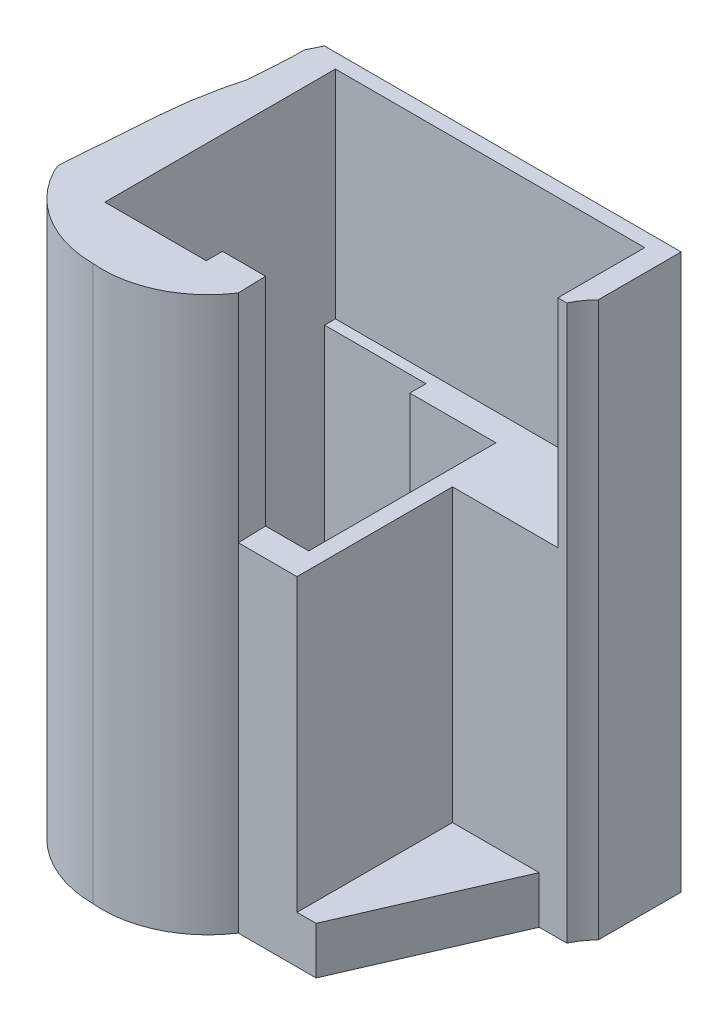
ISO-10303-21;
HEADER;
FILE_DESCRIPTION(('STEP AP214'),'2;1');
FILE_NAME('part.step','',(''),(''),'','','');
FILE_SCHEMA(('AUTOMOTIVE_DESIGN { 1 0 10303 214 1 1 1 1 }'));
ENDSEC;
DATA;
#1=APPLICATION_CONTEXT('core data for automotive mechanical design processes');
#2=APPLICATION_PROTOCOL_DEFINITION('international standard','automotive_design',2000,#1);
#3=PRODUCT_CONTEXT('',#1,'mechanical');
#4=PRODUCT('Part','Part','',(#3));
#5=PRODUCT_RELATED_PRODUCT_CATEGORY('part','',(#4));
#6=PRODUCT_DEFINITION_FORMATION('','',#4);
#7=PRODUCT_DEFINITION_CONTEXT('part definition',#1,'design');
#8=PRODUCT_DEFINITION('design','',#6,#7);
#9=PRODUCT_DEFINITION_SHAPE('','',#8);
#10=(LENGTH_UNIT() NAMED_UNIT(*) SI_UNIT(.MILLI.,.METRE.));
#11=(NAMED_UNIT(*) PLANE_ANGLE_UNIT() SI_UNIT($,.RADIAN.));
#12=(NAMED_UNIT(*) SI_UNIT($,.STERADIAN.) SOLID_ANGLE_UNIT());
#13=UNCERTAINTY_MEASURE_WITH_UNIT(LENGTH_MEASURE(1.E-05),#10,'distance_accuracy_value','');
#14=(GEOMETRIC_REPRESENTATION_CONTEXT(3) GLOBAL_UNCERTAINTY_ASSIGNED_CONTEXT((#13)) GLOBAL_UNIT_ASSIGNED_CONTEXT((#10,
#11,#12)) REPRESENTATION_CONTEXT('',''));
#15=CARTESIAN_POINT('',(0.,0.,0.));
#16=DIRECTION('',(0.,0.,1.));
#17=DIRECTION('',(1.,0.,0.));
#18=AXIS2_PLACEMENT_3D('',#15,#16,#17);
#19=CARTESIAN_POINT('',(-3.17398927918233,105.,-16.7844868257719));
#20=DIRECTION('',(0.,0.,-1.));
#21=DIRECTION('',(-1.,0.,0.));
#22=AXIS2_PLACEMENT_3D('',#19,#20,#21);
#23=PLANE('',#22);
#24=DIRECTION('',(1.,0.,0.));
#25=VECTOR('',#24,1.);
#26=CARTESIAN_POINT('',(-3.17398927918233,50.,-16.7844868257719));
#27=LINE('',#26,#25);
#28=CARTESIAN_POINT('',(-18.1734399627761,50.,-16.7844868257719));
#29=VERTEX_POINT('',#28);
#30=CARTESIAN_POINT('',(-3.17398927918233,50.,-16.7844868257719));
#31=VERTEX_POINT('',#30);
#32=EDGE_CURVE('E268',#29,#31,#27,.T.);
#33=ORIENTED_EDGE('',*,*,#32,.F.);
#34=DIRECTION('',(0.,-1.,0.));
#35=VECTOR('',#34,1.);
#36=CARTESIAN_POINT('',(-18.1734399627761,105.,-16.7844868257719));
#37=LINE('',#36,#35);
#38=CARTESIAN_POINT('',(-18.1734399627761,0.,-16.7844868257719));
#39=VERTEX_POINT('',#38);
#40=EDGE_CURVE('E267',#29,#39,#37,.T.);
#41=ORIENTED_EDGE('',*,*,#40,.T.);
#42=DIRECTION('',(1.,0.,0.));
#43=VECTOR('',#42,1.);
#44=CARTESIAN_POINT('',(-3.17398927918233,0.,-16.7844868257719));
#45=LINE('',#44,#43);
#46=CARTESIAN_POINT('',(-3.17398927918233,0.,-16.7844868257719));
#47=VERTEX_POINT('',#46);
#48=EDGE_CURVE('E315',#39,#47,#45,.T.);
#49=ORIENTED_EDGE('',*,*,#48,.T.);
#50=DIRECTION('',(0.,-1.,0.));
#51=VECTOR('',#50,1.);
#52=CARTESIAN_POINT('',(-3.17398927918233,105.,-16.7844868257719));
#53=LINE('',#52,#51);
#54=EDGE_CURVE('E64',#31,#47,#53,.T.);
#55=ORIENTED_EDGE('',*,*,#54,.F.);
#56=EDGE_LOOP('',(#33,#41,#49,#55));
#57=FACE_BOUND('',#56,.T.);
#58=ADVANCED_FACE('F41',(#57),#23,.F.);
#59=CARTESIAN_POINT('',(9.57552243956772,105.,-14.384485299893));
#60=DIRECTION('',(0.,0.,-1.));
#61=DIRECTION('',(-1.,0.,0.));
#62=AXIS2_PLACEMENT_3D('',#59,#60,#61);
#63=PLANE('',#62);
#64=DIRECTION('',(1.,0.,0.));
#65=VECTOR('',#64,1.);
#66=CARTESIAN_POINT('',(9.57552243956772,50.,-14.384485299893));
#67=LINE('',#66,#65);
#68=CARTESIAN_POINT('',(-3.17398927918233,50.,-14.384485299893));
#69=VERTEX_POINT('',#68);
#70=CARTESIAN_POINT('',(9.57552243956772,50.,-14.384485299893));
#71=VERTEX_POINT('',#70);
#72=EDGE_CURVE('E262',#69,#71,#67,.T.);
#73=ORIENTED_EDGE('',*,*,#72,.F.);
#74=DIRECTION('',(0.,-1.,0.));
#75=VECTOR('',#74,1.);
#76=CARTESIAN_POINT('',(-3.17398927918233,105.,-14.384485299893));
#77=LINE('',#76,#75);
#78=CARTESIAN_POINT('',(-3.17398927918233,0.,-14.384485299893));
#79=VERTEX_POINT('',#78);
#80=EDGE_CURVE('E348',#69,#79,#77,.T.);
#81=ORIENTED_EDGE('',*,*,#80,.T.);
#82=DIRECTION('',(1.,0.,0.));
#83=VECTOR('',#82,1.);
#84=CARTESIAN_POINT('',(9.57552243956772,0.,-14.384485299893));
#85=LINE('',#84,#83);
#86=CARTESIAN_POINT('',(9.57552243956772,0.,-14.384485299893));
#87=VERTEX_POINT('',#86);
#88=EDGE_CURVE('E319',#79,#87,#85,.T.);
#89=ORIENTED_EDGE('',*,*,#88,.T.);
#90=DIRECTION('',(0.,-1.,0.));
#91=VECTOR('',#90,1.);
#92=CARTESIAN_POINT('',(9.57552243956772,105.,-14.384485299893));
#93=LINE('',#92,#91);
#94=EDGE_CURVE('E346',#71,#87,#93,.T.);
#95=ORIENTED_EDGE('',*,*,#94,.F.);
#96=EDGE_LOOP('',(#73,#81,#89,#95));
#97=FACE_BOUND('',#96,.T.);
#98=ADVANCED_FACE('F556',(#97),#63,.F.);
#99=CARTESIAN_POINT('',(-3.17398927918233,105.,-14.384485299893));
#100=DIRECTION('',(1.,0.,0.));
#101=DIRECTION('',(0.,0.,-1.));
#102=AXIS2_PLACEMENT_3D('',#99,#100,#101);
#103=PLANE('',#102);
#104=DIRECTION('',(0.,0.,1.));
#105=VECTOR('',#104,1.);
#106=CARTESIAN_POINT('',(-3.17398927918233,50.,-14.384485299893));
#107=LINE('',#106,#105);
#108=EDGE_CURVE('E270',#31,#69,#107,.T.);
#109=ORIENTED_EDGE('',*,*,#108,.F.);
#110=ORIENTED_EDGE('',*,*,#54,.T.);
#111=DIRECTION('',(0.,0.,1.));
#112=VECTOR('',#111,1.);
#113=CARTESIAN_POINT('',(-3.17398927918233,0.,-14.384485299893));
#114=LINE('',#113,#112);
#115=EDGE_CURVE('E317',#47,#79,#114,.T.);
#116=ORIENTED_EDGE('',*,*,#115,.T.);
#117=ORIENTED_EDGE('',*,*,#80,.F.);
#118=EDGE_LOOP('',(#109,#110,#116,#117));
#119=FACE_BOUND('',#118,.T.);
#120=ADVANCED_FACE('F563',(#119),#103,.F.);
#121=CARTESIAN_POINT('',(3.32044667223164,82.,17.4700339500639));
#122=DIRECTION('',(0.,0.,-1.));
#123=DIRECTION('',(-1.,0.,0.));
#124=AXIS2_PLACEMENT_3D('',#121,#122,#123);
#125=PLANE('',#124);
#126=DIRECTION('',(1.,0.,0.));
#127=VECTOR('',#126,1.);
#128=CARTESIAN_POINT('',(3.32044667223164,50.,17.4700339500639));
#129=LINE('',#128,#127);
#130=CARTESIAN_POINT('',(3.32044667223164,50.,17.4700339500639));
#131=VERTEX_POINT('',#130);
#132=CARTESIAN_POINT('',(12.,50.,17.4700339500639));
#133=VERTEX_POINT('',#132);
#134=EDGE_CURVE('E275',#131,#133,#129,.T.);
#135=ORIENTED_EDGE('',*,*,#134,.F.);
#136=DIRECTION('',(0.,-1.,0.));
#137=VECTOR('',#136,1.);
#138=CARTESIAN_POINT('',(3.32044667223164,82.,17.4700339500639));
#139=LINE('',#138,#137);
#140=CARTESIAN_POINT('',(3.32044667223164,0.,17.4700339500639));
#141=VERTEX_POINT('',#140);
#142=EDGE_CURVE('E441',#131,#141,#139,.T.);
#143=ORIENTED_EDGE('',*,*,#142,.T.);
#144=DIRECTION('',(1.,0.,0.));
#145=VECTOR('',#144,1.);
#146=CARTESIAN_POINT('',(3.32044667223164,0.,17.4700339500639));
#147=LINE('',#146,#145);
#148=CARTESIAN_POINT('',(14.8200194261378,0.,17.4700339500639));
#149=VERTEX_POINT('',#148);
#150=EDGE_CURVE('E413',#141,#149,#147,.T.);
#151=ORIENTED_EDGE('',*,*,#150,.T.);
#152=DIRECTION('',(0.,-1.,0.));
#153=VECTOR('',#152,1.);
#154=CARTESIAN_POINT('',(14.8200194261378,82.,17.4700339500639));
#155=LINE('',#154,#153);
#156=CARTESIAN_POINT('',(14.8200194261378,7.00000000000001,17.4700339500639));
#157=VERTEX_POINT('',#156);
#158=EDGE_CURVE('E439',#157,#149,#155,.T.);
#159=ORIENTED_EDGE('',*,*,#158,.F.);
#160=DIRECTION('',(1.,0.,0.));
#161=VECTOR('',#160,1.);
#162=CARTESIAN_POINT('',(12.,7.,17.4700339500639));
#163=LINE('',#162,#161);
#164=CARTESIAN_POINT('',(12.,7.,17.4700339500639));
#165=VERTEX_POINT('',#164);
#166=EDGE_CURVE('E56',#165,#157,#163,.T.);
#167=ORIENTED_EDGE('',*,*,#166,.F.);
#168=DIRECTION('',(0.,-1.,0.));
#169=VECTOR('',#168,1.);
#170=CARTESIAN_POINT('',(12.,50.,17.4700339500639));
#171=LINE('',#170,#169);
#172=EDGE_CURVE('E292',#133,#165,#171,.T.);
#173=ORIENTED_EDGE('',*,*,#172,.F.);
#174=EDGE_LOOP('',(#135,#143,#151,#159,#167,#173));
#175=FACE_BOUND('',#174,.T.);
#176=ADVANCED_FACE('F523',(#175),#125,.F.);
#177=CARTESIAN_POINT('',(9.57552243956771,105.,13.3155085489076));
#178=DIRECTION('',(1.,0.,0.));
#179=DIRECTION('',(0.,0.,-1.));
#180=AXIS2_PLACEMENT_3D('',#177,#178,#179);
#181=PLANE('',#180);
#182=DIRECTION('',(0.,0.,1.));
#183=VECTOR('',#182,1.);
#184=CARTESIAN_POINT('',(9.57552243956772,50.,-14.384485299893));
#185=LINE('',#184,#183);
#186=CARTESIAN_POINT('',(9.57552243956771,50.,13.3155085489076));
#187=VERTEX_POINT('',#186);
#188=EDGE_CURVE('E252',#71,#187,#185,.T.);
#189=ORIENTED_EDGE('',*,*,#188,.F.);
#190=ORIENTED_EDGE('',*,*,#94,.T.);
#191=DIRECTION('',(0.,0.,1.));
#192=VECTOR('',#191,1.);
#193=CARTESIAN_POINT('',(9.57552243956771,0.,13.3155085489076));
#194=LINE('',#193,#192);
#195=CARTESIAN_POINT('',(9.57552243956771,0.,13.3155085489076));
#196=VERTEX_POINT('',#195);
#197=EDGE_CURVE('E322',#87,#196,#194,.T.);
#198=ORIENTED_EDGE('',*,*,#197,.T.);
#199=DIRECTION('',(0.,-1.,0.));
#200=VECTOR('',#199,1.);
#201=CARTESIAN_POINT('',(9.57552243956771,105.,13.3155085489076));
#202=LINE('',#201,#200);
#203=EDGE_CURVE('E344',#187,#196,#202,.T.);
#204=ORIENTED_EDGE('',*,*,#203,.F.);
#205=EDGE_LOOP('',(#189,#190,#198,#204));
#206=FACE_BOUND('',#205,.T.);
#207=ADVANCED_FACE('F585',(#206),#181,.F.);
#208=CARTESIAN_POINT('',(-21.9286378004247,82.,-20.5299655568312));
#209=DIRECTION('',(0.894438171681325,0.,0.447191633463069));
#210=DIRECTION('',(0.447191633463069,0.,-0.894438171681325));
#211=AXIS2_PLACEMENT_3D('',#208,#209,#210);
#212=PLANE('',#211);
#213=DIRECTION('',(-0.447191633463069,0.,0.894438171681325));
#214=VECTOR('',#213,1.);
#215=CARTESIAN_POINT('',(-21.9286378004247,0.,-20.5299655568312));
#216=LINE('',#215,#214);
#217=CARTESIAN_POINT('',(-21.9286378004247,0.,-20.5299655568312));
#218=VERTEX_POINT('',#217);
#219=CARTESIAN_POINT('',(-22.9285767652684,0.,-18.5299648578432));
#220=VERTEX_POINT('',#219);
#221=EDGE_CURVE('E359',#218,#220,#216,.T.);
#222=ORIENTED_EDGE('',*,*,#221,.T.);
#223=DIRECTION('',(0.,-1.,0.));
#224=VECTOR('',#223,1.);
#225=CARTESIAN_POINT('',(-22.9285767652684,82.,-18.5299648578432));
#226=LINE('',#225,#224);
#227=CARTESIAN_POINT('',(-22.9285767652684,82.,-18.5299648578432));
#228=VERTEX_POINT('',#227);
#229=EDGE_CURVE('E11',#228,#220,#226,.T.);
#230=ORIENTED_EDGE('',*,*,#229,.F.);
#231=DIRECTION('',(-0.447191633463069,0.,0.894438171681325));
#232=VECTOR('',#231,1.);
#233=CARTESIAN_POINT('',(-21.9286378004247,82.,-20.5299655568312));
#234=LINE('',#233,#232);
#235=CARTESIAN_POINT('',(-21.9286378004247,82.,-20.5299655568312));
#236=VERTEX_POINT('',#235);
#237=EDGE_CURVE('E360',#236,#228,#234,.T.);
#238=ORIENTED_EDGE('',*,*,#237,.F.);
#239=DIRECTION('',(0.,-1.,0.));
#240=VECTOR('',#239,1.);
#241=CARTESIAN_POINT('',(-21.9286378004247,82.,-20.5299655568312));
#242=LINE('',#241,#240);
#243=EDGE_CURVE('E391',#236,#218,#242,.T.);
#244=ORIENTED_EDGE('',*,*,#243,.T.);
#245=EDGE_LOOP('',(#222,#230,#238,#244));
#246=FACE_BOUND('',#245,.T.);
#247=ADVANCED_FACE('F43',(#246),#212,.F.);
#248=CARTESIAN_POINT('',(-22.9285767652684,82.,-18.5299648578432));
#249=DIRECTION('',(1.,0.,0.));
#250=DIRECTION('',(0.,0.,-1.));
#251=AXIS2_PLACEMENT_3D('',#248,#249,#250);
#252=PLANE('',#251);
#253=DIRECTION('',(0.,0.,1.));
#254=VECTOR('',#253,1.);
#255=CARTESIAN_POINT('',(-22.9285767652684,0.,-18.5299648578432));
#256=LINE('',#255,#254);
#257=CARTESIAN_POINT('',(-22.9285767652684,0.,-16.529967242029));
#258=VERTEX_POINT('',#257);
#259=EDGE_CURVE('E394',#220,#258,#256,.T.);
#260=ORIENTED_EDGE('',*,*,#259,.T.);
#261=DIRECTION('',(0.,-1.,0.));
#262=VECTOR('',#261,1.);
#263=CARTESIAN_POINT('',(-22.9285767652684,82.,-16.529967242029));
#264=LINE('',#263,#262);
#265=CARTESIAN_POINT('',(-22.9285767652684,82.,-16.529967242029));
#266=VERTEX_POINT('',#265);
#267=EDGE_CURVE('E49',#266,#258,#264,.T.);
#268=ORIENTED_EDGE('',*,*,#267,.F.);
#269=DIRECTION('',(0.,0.,1.));
#270=VECTOR('',#269,1.);
#271=CARTESIAN_POINT('',(-22.9285767652684,82.,-18.5299648578432));
#272=LINE('',#271,#270);
#273=EDGE_CURVE('E363',#228,#266,#272,.T.);
#274=ORIENTED_EDGE('',*,*,#273,.F.);
#275=ORIENTED_EDGE('',*,*,#229,.T.);
#276=EDGE_LOOP('',(#260,#268,#274,#275));
#277=FACE_BOUND('',#276,.T.);
#278=ADVANCED_FACE('F492',(#277),#252,.F.);
#279=CARTESIAN_POINT('',(-22.9285767652684,82.,-16.529967242029));
#280=DIRECTION('',(0.997784889958697,0.,0.0665230288705358));
#281=DIRECTION('',(0.0665230288705358,0.,-0.997784889958697));
#282=AXIS2_PLACEMENT_3D('',#279,#280,#281);
#283=PLANE('',#282);
#284=DIRECTION('',(-0.0665230288705358,0.,0.997784889958697));
#285=VECTOR('',#284,1.);
#286=CARTESIAN_POINT('',(-22.9285767652684,0.,-16.529967242029));
#287=LINE('',#286,#285);
#288=CARTESIAN_POINT('',(-23.3286011793309,0.,-10.5299650962617));
#289=VERTEX_POINT('',#288);
#290=EDGE_CURVE('E396',#258,#289,#287,.T.);
#291=ORIENTED_EDGE('',*,*,#290,.T.);
#292=DIRECTION('',(0.,-1.,0.));
#293=VECTOR('',#292,1.);
#294=CARTESIAN_POINT('',(-23.3286011793309,82.,-10.5299650962617));
#295=LINE('',#294,#293);
#296=CARTESIAN_POINT('',(-23.3286011793309,82.,-10.5299650962617));
#297=VERTEX_POINT('',#296);
#298=EDGE_CURVE('E462',#297,#289,#295,.T.);
#299=ORIENTED_EDGE('',*,*,#298,.F.);
#300=DIRECTION('',(-0.0665230288705358,0.,0.997784889958697));
#301=VECTOR('',#300,1.);
#302=CARTESIAN_POINT('',(-22.9285767652684,82.,-16.529967242029));
#303=LINE('',#302,#301);
#304=EDGE_CURVE('E366',#266,#297,#303,.T.);
#305=ORIENTED_EDGE('',*,*,#304,.F.);
#306=ORIENTED_EDGE('',*,*,#267,.T.);
#307=EDGE_LOOP('',(#291,#299,#305,#306));
#308=FACE_BOUND('',#307,.T.);
#309=ADVANCED_FACE('F469',(#308),#283,.F.);
#310=CARTESIAN_POINT('',(-23.3286011793309,82.,-10.5299650962617));
#311=DIRECTION('',(0.969796686896652,0.,0.243914710676246));
#312=DIRECTION('',(0.243914710676246,0.,-0.969796686896652));
#313=AXIS2_PLACEMENT_3D('',#310,#311,#312);
#314=PLANE('',#313);
#315=DIRECTION('',(-0.243914710676246,0.,0.969796686896652));
#316=VECTOR('',#315,1.);
#317=CARTESIAN_POINT('',(-23.3286011793309,0.,-10.5299650962617));
#318=LINE('',#317,#316);
#319=CARTESIAN_POINT('',(-24.1028931715184,0.,-7.45140617444779));
#320=VERTEX_POINT('',#319);
#321=EDGE_CURVE('E398',#289,#320,#318,.T.);
#322=ORIENTED_EDGE('',*,*,#321,.T.);
#323=DIRECTION('',(0.,-1.,0.));
#324=VECTOR('',#323,1.);
#325=CARTESIAN_POINT('',(-24.1028931715184,82.,-7.45140617444779));
#326=LINE('',#325,#324);
#327=CARTESIAN_POINT('',(-24.1028931715184,82.,-7.45140617444779));
#328=VERTEX_POINT('',#327);
#329=EDGE_CURVE('E459',#328,#320,#326,.T.);
#330=ORIENTED_EDGE('',*,*,#329,.F.);
#331=DIRECTION('',(-0.243914710676246,0.,0.969796686896652));
#332=VECTOR('',#331,1.);
#333=CARTESIAN_POINT('',(-23.3286011793309,82.,-10.5299650962617));
#334=LINE('',#333,#332);
#335=EDGE_CURVE('E368',#297,#328,#334,.T.);
#336=ORIENTED_EDGE('',*,*,#335,.F.);
#337=ORIENTED_EDGE('',*,*,#298,.T.);
#338=EDGE_LOOP('',(#322,#330,#336,#337));
#339=FACE_BOUND('',#338,.T.);
#340=ADVANCED_FACE('F480',(#339),#314,.F.);
#341=CARTESIAN_POINT('',(-24.1028931715184,82.,-7.45140617444779));
#342=DIRECTION('',(0.983227813197259,0.,0.182381653011854));
#343=DIRECTION('',(0.182381653011854,0.,-0.983227813197259));
#344=AXIS2_PLACEMENT_3D('',#341,#342,#343);
#345=PLANE('',#344);
#346=DIRECTION('',(-0.182381653011854,0.,0.983227813197259));
#347=VECTOR('',#346,1.);
#348=CARTESIAN_POINT('',(-24.1028931715184,0.,-7.45140617444779));
#349=LINE('',#348,#347);
#350=CARTESIAN_POINT('',(-24.8442872144872,0.,-3.4545170600679));
#351=VERTEX_POINT('',#350);
#352=EDGE_CURVE('E400',#320,#351,#349,.T.);
#353=ORIENTED_EDGE('',*,*,#352,.T.);
#354=DIRECTION('',(0.,-1.,0.));
#355=VECTOR('',#354,1.);
#356=CARTESIAN_POINT('',(-24.8442872144872,82.,-3.4545170600679));
#357=LINE('',#356,#355);
#358=CARTESIAN_POINT('',(-24.8442872144872,82.,-3.4545170600679));
#359=VERTEX_POINT('',#358);
#360=EDGE_CURVE('E456',#359,#351,#357,.T.);
#361=ORIENTED_EDGE('',*,*,#360,.F.);
#362=DIRECTION('',(-0.182381653011854,0.,0.983227813197259));
#363=VECTOR('',#362,1.);
#364=CARTESIAN_POINT('',(-24.1028931715184,82.,-7.45140617444779));
#365=LINE('',#364,#363);
#366=EDGE_CURVE('E370',#328,#359,#365,.T.);
#367=ORIENTED_EDGE('',*,*,#366,.F.);
#368=ORIENTED_EDGE('',*,*,#329,.T.);
#369=EDGE_LOOP('',(#353,#361,#367,#368));
#370=FACE_BOUND('',#369,.T.);
#371=ADVANCED_FACE('F484',(#370),#345,.F.);
#372=CARTESIAN_POINT('',(-24.8442872144872,82.,-3.4545170600679));
#373=DIRECTION('',(0.993883410928614,0.,0.110434439740975));
#374=DIRECTION('',(0.110434439740975,0.,-0.993883410928615));
#375=AXIS2_PLACEMENT_3D('',#372,#373,#374);
#376=PLANE('',#375);
#377=DIRECTION('',(-0.110434439740975,0.,0.993883410928615));
#378=VECTOR('',#377,1.);
#379=CARTESIAN_POINT('',(-24.8442872144872,0.,-3.4545170600679));
#380=LINE('',#379,#378);
#381=CARTESIAN_POINT('',(-25.2886231519871,0.,0.544399565908661));
#382=VERTEX_POINT('',#381);
#383=EDGE_CURVE('E402',#351,#382,#380,.T.);
#384=ORIENTED_EDGE('',*,*,#383,.T.);
#385=DIRECTION('',(0.,-1.,0.));
#386=VECTOR('',#385,1.);
#387=CARTESIAN_POINT('',(-25.2886231519871,82.,0.544399565908661));
#388=LINE('',#387,#386);
#389=CARTESIAN_POINT('',(-25.2886231519871,82.,0.544399565908661));
#390=VERTEX_POINT('',#389);
#391=EDGE_CURVE('E453',#390,#382,#388,.T.);
#392=ORIENTED_EDGE('',*,*,#391,.F.);
#393=DIRECTION('',(-0.110434439740975,0.,0.993883410928615));
#394=VECTOR('',#393,1.);
#395=CARTESIAN_POINT('',(-24.8442872144872,82.,-3.4545170600679));
#396=LINE('',#395,#394);
#397=EDGE_CURVE('E372',#359,#390,#396,.T.);
#398=ORIENTED_EDGE('',*,*,#397,.F.);
#399=ORIENTED_EDGE('',*,*,#360,.T.);
#400=EDGE_LOOP('',(#384,#392,#398,#399));
#401=FACE_BOUND('',#400,.T.);
#402=ADVANCED_FACE('F546',(#401),#376,.F.);
#403=CARTESIAN_POINT('',(-25.2886231519871,82.,0.544399565908661));
#404=DIRECTION('',(0.997223646080991,0.,0.0744647547295677));
#405=DIRECTION('',(0.0744647547295677,0.,-0.997223646080991));
#406=AXIS2_PLACEMENT_3D('',#403,#404,#405);
#407=PLANE('',#406);
#408=DIRECTION('',(-0.0744647547295677,0.,0.997223646080991));
#409=VECTOR('',#408,1.);
#410=CARTESIAN_POINT('',(-25.2886231519871,0.,0.544399565908661));
#411=LINE('',#410,#409);
#412=CARTESIAN_POINT('',(-26.3284791090184,0.,14.4700339500639));
#413=VERTEX_POINT('',#412);
#414=EDGE_CURVE('E404',#382,#413,#411,.T.);
#415=ORIENTED_EDGE('',*,*,#414,.T.);
#416=DIRECTION('',(0.,-1.,0.));
#417=VECTOR('',#416,1.);
#418=CARTESIAN_POINT('',(-26.3284791090184,82.,14.4700339500639));
#419=LINE('',#418,#417);
#420=CARTESIAN_POINT('',(-26.3284791090184,82.,14.4700339500639));
#421=VERTEX_POINT('',#420);
#422=EDGE_CURVE('E450',#421,#413,#419,.T.);
#423=ORIENTED_EDGE('',*,*,#422,.F.);
#424=DIRECTION('',(-0.0744647547295677,0.,0.997223646080991));
#425=VECTOR('',#424,1.);
#426=CARTESIAN_POINT('',(-25.2886231519871,82.,0.544399565908661));
#427=LINE('',#426,#425);
#428=EDGE_CURVE('E374',#390,#421,#427,.T.);
#429=ORIENTED_EDGE('',*,*,#428,.F.);
#430=ORIENTED_EDGE('',*,*,#391,.T.);
#431=EDGE_LOOP('',(#415,#423,#429,#430));
#432=FACE_BOUND('',#431,.T.);
#433=ADVANCED_FACE('F543',(#432),#407,.F.);
#434=CARTESIAN_POINT('',(-26.3284791090184,82.,14.4700339500639));
#435=DIRECTION('',(0.922141198336528,0.,-0.386853473980101));
#436=DIRECTION('',(-0.386853473980101,0.,-0.922141198336528));
#437=AXIS2_PLACEMENT_3D('',#434,#435,#436);
#438=PLANE('',#437);
#439=DIRECTION('',(0.386853473980101,0.,0.922141198336528));
#440=VECTOR('',#439,1.);
#441=CARTESIAN_POINT('',(-26.3284791090184,0.,14.4700339500639));
#442=LINE('',#441,#440);
#443=CARTESIAN_POINT('',(-25.9249146558934,0.,15.4320090477202));
#444=VERTEX_POINT('',#443);
#445=EDGE_CURVE('E406',#413,#444,#442,.T.);
#446=ORIENTED_EDGE('',*,*,#445,.T.);
#447=DIRECTION('',(0.,-1.,0.));
#448=VECTOR('',#447,1.);
#449=CARTESIAN_POINT('',(-25.9249146558934,82.,15.4320090477202));
#450=LINE('',#449,#448);
#451=CARTESIAN_POINT('',(-25.9249146558934,82.,15.4320090477202));
#452=VERTEX_POINT('',#451);
#453=EDGE_CURVE('E447',#452,#444,#450,.T.);
#454=ORIENTED_EDGE('',*,*,#453,.F.);
#455=DIRECTION('',(0.386853473980101,0.,0.922141198336528));
#456=VECTOR('',#455,1.);
#457=CARTESIAN_POINT('',(-26.3284791090184,82.,14.4700339500639));
#458=LINE('',#457,#456);
#459=EDGE_CURVE('E376',#421,#452,#458,.T.);
#460=ORIENTED_EDGE('',*,*,#459,.F.);
#461=ORIENTED_EDGE('',*,*,#422,.T.);
#462=EDGE_LOOP('',(#446,#454,#460,#461));
#463=FACE_BOUND('',#462,.T.);
#464=ADVANCED_FACE('F539',(#463),#438,.F.);
#465=CARTESIAN_POINT('',(-11.1226541266717,82.,7.78637273671122));
#466=DIRECTION('',(0.,-1.,0.));
#467=DIRECTION('',(0.,0.,-1.));
#468=AXIS2_PLACEMENT_3D('',#465,#466,#467);
#469=CYLINDRICAL_SURFACE('',#468,16.660212224794);
#470=CARTESIAN_POINT('',(-11.1226541266717,0.,7.78637273671122));
#471=DIRECTION('',(0.,1.,0.));
#472=DIRECTION('',(0.,0.,1.));
#473=AXIS2_PLACEMENT_3D('',#470,#471,#472);
#474=CIRCLE('',#473,16.660212224794);
#475=CARTESIAN_POINT('',(-11.2183106519872,0.,24.446310347769));
#476=VERTEX_POINT('',#475);
#477=EDGE_CURVE('E408',#444,#476,#474,.T.);
#478=ORIENTED_EDGE('',*,*,#477,.T.);
#479=DIRECTION('',(0.,-1.,0.));
#480=VECTOR('',#479,1.);
#481=CARTESIAN_POINT('',(-11.2183106519872,82.,24.446310347769));
#482=LINE('',#481,#480);
#483=CARTESIAN_POINT('',(-11.2183106519872,82.,24.446310347769));
#484=VERTEX_POINT('',#483);
#485=EDGE_CURVE('E444',#484,#476,#482,.T.);
#486=ORIENTED_EDGE('',*,*,#485,.F.);
#487=CARTESIAN_POINT('',(-11.1226541266717,82.,7.78637273671122));
#488=DIRECTION('',(0.,1.,0.));
#489=DIRECTION('',(0.,0.,1.));
#490=AXIS2_PLACEMENT_3D('',#487,#488,#489);
#491=CIRCLE('',#490,16.660212224794);
#492=EDGE_CURVE('E378',#452,#484,#491,.T.);
#493=ORIENTED_EDGE('',*,*,#492,.F.);
#494=ORIENTED_EDGE('',*,*,#453,.T.);
#495=EDGE_LOOP('',(#478,#486,#493,#494));
#496=FACE_BOUND('',#495,.T.);
#497=ADVANCED_FACE('F535',(#496),#469,.T.);
#498=CARTESIAN_POINT('',(-9.72413293878074,82.,8.92249003025516));
#499=DIRECTION('',(0.,-1.,0.));
#500=DIRECTION('',(0.,0.,-1.));
#501=AXIS2_PLACEMENT_3D('',#498,#499,#500);
#502=CYLINDRICAL_SURFACE('',#501,15.5955623267999);
#503=CARTESIAN_POINT('',(-9.72413293878074,0.,8.92249003025516));
#504=DIRECTION('',(0.,1.,0.));
#505=DIRECTION('',(0.,0.,1.));
#506=AXIS2_PLACEMENT_3D('',#503,#504,#505);
#507=CIRCLE('',#506,15.5955623267999);
#508=EDGE_CURVE('E410',#476,#141,#507,.T.);
#509=ORIENTED_EDGE('',*,*,#508,.T.);
#510=ORIENTED_EDGE('',*,*,#142,.F.);
#511=CARTESIAN_POINT('',(3.32044667223164,82.,17.4700339500639));
#512=VERTEX_POINT('',#511);
#513=EDGE_CURVE('E442',#512,#131,#139,.T.);
#514=ORIENTED_EDGE('',*,*,#513,.F.);
#515=CARTESIAN_POINT('',(-9.72413293878074,82.,8.92249003025516));
#516=DIRECTION('',(0.,1.,0.));
#517=DIRECTION('',(0.,0.,1.));
#518=AXIS2_PLACEMENT_3D('',#515,#516,#517);
#519=CIRCLE('',#518,15.5955623267999);
#520=EDGE_CURVE('E380',#484,#512,#519,.T.);
#521=ORIENTED_EDGE('',*,*,#520,.F.);
#522=ORIENTED_EDGE('',*,*,#485,.T.);
#523=EDGE_LOOP('',(#509,#510,#514,#521,#522));
#524=FACE_BOUND('',#523,.T.);
#525=ADVANCED_FACE('F529',(#524),#502,.T.);
#526=CARTESIAN_POINT('',(14.8200194261378,82.,17.4700339500639));
#527=DIRECTION('',(-0.91707628535055,0.,-0.398711784184563));
#528=DIRECTION('',(-0.398711784184563,0.,0.91707628535055));
#529=AXIS2_PLACEMENT_3D('',#526,#527,#528);
#530=PLANE('',#529);
#531=DIRECTION('',(0.,-1.,0.));
#532=VECTOR('',#531,1.);
#533=CARTESIAN_POINT('',(24.8195921800441,82.,-5.52996604993607));
#534=LINE('',#533,#532);
#535=CARTESIAN_POINT('',(24.8195921800441,7.,-5.52996604993607));
#536=VERTEX_POINT('',#535);
#537=CARTESIAN_POINT('',(24.8195921800441,0.,-5.52996604993607));
#538=VERTEX_POINT('',#537);
#539=EDGE_CURVE('E437',#536,#538,#534,.T.);
#540=ORIENTED_EDGE('',*,*,#539,.F.);
#541=DIRECTION('',(-0.398711784184563,0.,0.91707628535055));
#542=VECTOR('',#541,1.);
#543=CARTESIAN_POINT('',(14.8200194261378,7.00000000000001,17.4700339500639));
#544=LINE('',#543,#542);
#545=EDGE_CURVE('E309',#536,#157,#544,.T.);
#546=ORIENTED_EDGE('',*,*,#545,.T.);
#547=ORIENTED_EDGE('',*,*,#158,.T.);
#548=DIRECTION('',(0.398711784184563,0.,-0.91707628535055));
#549=VECTOR('',#548,1.);
#550=CARTESIAN_POINT('',(14.8200194261378,0.,17.4700339500639));
#551=LINE('',#550,#549);
#552=EDGE_CURVE('E416',#149,#538,#551,.T.);
#553=ORIENTED_EDGE('',*,*,#552,.T.);
#554=EDGE_LOOP('',(#540,#546,#547,#553));
#555=FACE_BOUND('',#554,.T.);
#556=ADVANCED_FACE('F519',(#555),#530,.F.);
#557=CARTESIAN_POINT('',(24.8195921800441,82.,-5.52996604993607));
#558=DIRECTION('',(0.,0.,-1.));
#559=DIRECTION('',(-1.,0.,0.));
#560=AXIS2_PLACEMENT_3D('',#557,#558,#559);
#561=PLANE('',#560);
#562=DIRECTION('',(1.,0.,0.));
#563=VECTOR('',#562,1.);
#564=CARTESIAN_POINT('',(24.8195921800441,82.,-5.52996604993607));
#565=LINE('',#564,#563);
#566=CARTESIAN_POINT('',(27.5755224395677,82.,-5.52996604993607));
#567=VERTEX_POINT('',#566);
#568=CARTESIAN_POINT('',(28.8980833909821,82.,-5.52996604993607));
#569=VERTEX_POINT('',#568);
#570=EDGE_CURVE('E383',#567,#569,#565,.T.);
#571=ORIENTED_EDGE('',*,*,#570,.F.);
#572=DIRECTION('',(0.,1.,0.));
#573=VECTOR('',#572,1.);
#574=CARTESIAN_POINT('',(27.5755224395677,50.,-5.52996604993607));
#575=LINE('',#574,#573);
#576=CARTESIAN_POINT('',(27.5755224395677,50.,-5.52996604993607));
#577=VERTEX_POINT('',#576);
#578=EDGE_CURVE('E285',#577,#567,#575,.T.);
#579=ORIENTED_EDGE('',*,*,#578,.F.);
#580=DIRECTION('',(1.,0.,0.));
#581=VECTOR('',#580,1.);
#582=CARTESIAN_POINT('',(12.,50.,-5.52996604993606));
#583=LINE('',#582,#581);
#584=CARTESIAN_POINT('',(12.,50.,-5.52996604993607));
#585=VERTEX_POINT('',#584);
#586=EDGE_CURVE('E307',#585,#577,#583,.T.);
#587=ORIENTED_EDGE('',*,*,#586,.F.);
#588=DIRECTION('',(0.,1.,0.));
#589=VECTOR('',#588,1.);
#590=CARTESIAN_POINT('',(12.,7.,-5.52996604993607));
#591=LINE('',#590,#589);
#592=CARTESIAN_POINT('',(12.,7.,-5.52996604993607));
#593=VERTEX_POINT('',#592);
#594=EDGE_CURVE('E301',#593,#585,#591,.T.);
#595=ORIENTED_EDGE('',*,*,#594,.F.);
#596=DIRECTION('',(1.,0.,0.));
#597=VECTOR('',#596,1.);
#598=CARTESIAN_POINT('',(12.,7.,-5.52996604993607));
#599=LINE('',#598,#597);
#600=EDGE_CURVE('E310',#593,#536,#599,.T.);
#601=ORIENTED_EDGE('',*,*,#600,.T.);
#602=ORIENTED_EDGE('',*,*,#539,.T.);
#603=DIRECTION('',(1.,0.,0.));
#604=VECTOR('',#603,1.);
#605=CARTESIAN_POINT('',(24.8195921800441,0.,-5.52996604993607));
#606=LINE('',#605,#604);
#607=CARTESIAN_POINT('',(28.8980833909821,0.,-5.52996604993607));
#608=VERTEX_POINT('',#607);
#609=EDGE_CURVE('E419',#538,#608,#606,.T.);
#610=ORIENTED_EDGE('',*,*,#609,.T.);
#611=DIRECTION('',(0.,-1.,0.));
#612=VECTOR('',#611,1.);
#613=CARTESIAN_POINT('',(28.8980833909821,82.,-5.52996604993607));
#614=LINE('',#613,#612);
#615=EDGE_CURVE('E435',#569,#608,#614,.T.);
#616=ORIENTED_EDGE('',*,*,#615,.F.);
#617=EDGE_LOOP('',(#571,#579,#587,#595,#601,#602,#610,#616));
#618=FACE_BOUND('',#617,.T.);
#619=ADVANCED_FACE('F515',(#618),#561,.F.);
#620=CARTESIAN_POINT('',(37.5132807326087,82.,-1.53125458519694));
#621=DIRECTION('',(0.,-1.,0.));
#622=DIRECTION('',(0.,0.,-1.));
#623=AXIS2_PLACEMENT_3D('',#620,#621,#622);
#624=CYLINDRICAL_SURFACE('',#623,9.497963919357);
#625=CARTESIAN_POINT('',(37.5132807326087,0.,-1.53125458519694));
#626=DIRECTION('',(0.,-1.,0.));
#627=DIRECTION('',(0.,0.,-1.));
#628=AXIS2_PLACEMENT_3D('',#625,#626,#627);
#629=CIRCLE('',#628,9.497963919357);
#630=CARTESIAN_POINT('',(30.8194103557289,0.,-8.26946042881271));
#631=VERTEX_POINT('',#630);
#632=EDGE_CURVE('E422',#608,#631,#629,.T.);
#633=ORIENTED_EDGE('',*,*,#632,.T.);
#634=DIRECTION('',(0.,-1.,0.));
#635=VECTOR('',#634,1.);
#636=CARTESIAN_POINT('',(30.8194103557289,82.,-8.26946042881271));
#637=LINE('',#636,#635);
#638=CARTESIAN_POINT('',(30.8194103557289,82.,-8.26946042881271));
#639=VERTEX_POINT('',#638);
#640=EDGE_CURVE('E432',#639,#631,#637,.T.);
#641=ORIENTED_EDGE('',*,*,#640,.F.);
#642=CARTESIAN_POINT('',(37.5132807326087,82.,-1.53125458519694));
#643=DIRECTION('',(0.,-1.,0.));
#644=DIRECTION('',(0.,0.,-1.));
#645=AXIS2_PLACEMENT_3D('',#642,#643,#644);
#646=CIRCLE('',#645,9.497963919357);
#647=EDGE_CURVE('E385',#569,#639,#646,.T.);
#648=ORIENTED_EDGE('',*,*,#647,.F.);
#649=ORIENTED_EDGE('',*,*,#615,.T.);
#650=EDGE_LOOP('',(#633,#641,#648,#649));
#651=FACE_BOUND('',#650,.T.);
#652=ADVANCED_FACE('F508',(#651),#624,.F.);
#653=CARTESIAN_POINT('',(30.8194103557289,82.,-20.5299655568312));
#654=DIRECTION('',(-1.,0.,0.));
#655=DIRECTION('',(0.,0.,1.));
#656=AXIS2_PLACEMENT_3D('',#653,#654,#655);
#657=PLANE('',#656);
#658=DIRECTION('',(0.,0.,-1.));
#659=VECTOR('',#658,1.);
#660=CARTESIAN_POINT('',(30.8194103557289,0.,-20.5299655568312));
#661=LINE('',#660,#659);
#662=CARTESIAN_POINT('',(30.8194103557289,0.,-20.5299655568312));
#663=VERTEX_POINT('',#662);
#664=EDGE_CURVE('E424',#631,#663,#661,.T.);
#665=ORIENTED_EDGE('',*,*,#664,.T.);
#666=DIRECTION('',(0.,-1.,0.));
#667=VECTOR('',#666,1.);
#668=CARTESIAN_POINT('',(30.8194103557289,82.,-20.5299655568312));
#669=LINE('',#668,#667);
#670=CARTESIAN_POINT('',(30.8194103557289,82.,-20.5299655568312));
#671=VERTEX_POINT('',#670);
#672=EDGE_CURVE('E429',#671,#663,#669,.T.);
#673=ORIENTED_EDGE('',*,*,#672,.F.);
#674=DIRECTION('',(0.,0.,-1.));
#675=VECTOR('',#674,1.);
#676=CARTESIAN_POINT('',(30.8194103557289,82.,-20.5299655568312));
#677=LINE('',#676,#675);
#678=EDGE_CURVE('E387',#639,#671,#677,.T.);
#679=ORIENTED_EDGE('',*,*,#678,.F.);
#680=ORIENTED_EDGE('',*,*,#640,.T.);
#681=EDGE_LOOP('',(#665,#673,#679,#680));
#682=FACE_BOUND('',#681,.T.);
#683=ADVANCED_FACE('F504',(#682),#657,.F.);
#684=CARTESIAN_POINT('',(-21.9286378004247,82.,-20.5299655568312));
#685=DIRECTION('',(0.,0.,1.));
#686=DIRECTION('',(1.,0.,0.));
#687=AXIS2_PLACEMENT_3D('',#684,#685,#686);
#688=PLANE('',#687);
#689=DIRECTION('',(-1.,0.,0.));
#690=VECTOR('',#689,1.);
#691=CARTESIAN_POINT('',(-21.9286378004247,0.,-20.5299655568312));
#692=LINE('',#691,#690);
#693=EDGE_CURVE('E364',#663,#218,#692,.T.);
#694=ORIENTED_EDGE('',*,*,#693,.T.);
#695=ORIENTED_EDGE('',*,*,#243,.F.);
#696=DIRECTION('',(-1.,0.,0.));
#697=VECTOR('',#696,1.);
#698=CARTESIAN_POINT('',(-21.9286378004247,82.,-20.5299655568312));
#699=LINE('',#698,#697);
#700=EDGE_CURVE('E389',#671,#236,#699,.T.);
#701=ORIENTED_EDGE('',*,*,#700,.F.);
#702=ORIENTED_EDGE('',*,*,#672,.T.);
#703=EDGE_LOOP('',(#694,#695,#701,#702));
#704=FACE_BOUND('',#703,.T.);
#705=ADVANCED_FACE('F499',(#704),#688,.F.);
#706=CARTESIAN_POINT('',(-11.1226541266717,82.,7.78637273671122));
#707=DIRECTION('',(0.,1.,0.));
#708=DIRECTION('',(0.,0.,1.));
#709=AXIS2_PLACEMENT_3D('',#706,#707,#708);
#710=PLANE('',#709);
#711=DIRECTION('',(0.,0.,1.));
#712=VECTOR('',#711,1.);
#713=CARTESIAN_POINT('',(-18.1734399627761,82.,7.78637273671122));
#714=LINE('',#713,#712);
#715=CARTESIAN_POINT('',(-18.1734399627761,82.,-18.384485299893));
#716=VERTEX_POINT('',#715);
#717=CARTESIAN_POINT('',(-18.1734399627761,82.,15.7155134126467));
#718=VERTEX_POINT('',#717);
#719=EDGE_CURVE('E357',#716,#718,#714,.T.);
#720=ORIENTED_EDGE('',*,*,#719,.F.);
#721=DIRECTION('',(-1.,0.,0.));
#722=VECTOR('',#721,1.);
#723=CARTESIAN_POINT('',(9.57552243956771,82.,-18.384485299893));
#724=LINE('',#723,#722);
#725=CARTESIAN_POINT('',(27.5755224395677,82.,-18.384485299893));
#726=VERTEX_POINT('',#725);
#727=EDGE_CURVE('E259',#726,#716,#724,.T.);
#728=ORIENTED_EDGE('',*,*,#727,.F.);
#729=DIRECTION('',(0.,0.,-1.));
#730=VECTOR('',#729,1.);
#731=CARTESIAN_POINT('',(27.5755224395677,82.,-18.384485299893));
#732=LINE('',#731,#730);
#733=EDGE_CURVE('E261',#567,#726,#732,.T.);
#734=ORIENTED_EDGE('',*,*,#733,.F.);
#735=ORIENTED_EDGE('',*,*,#570,.T.);
#736=ORIENTED_EDGE('',*,*,#647,.T.);
#737=ORIENTED_EDGE('',*,*,#678,.T.);
#738=ORIENTED_EDGE('',*,*,#700,.T.);
#739=ORIENTED_EDGE('',*,*,#237,.T.);
#740=ORIENTED_EDGE('',*,*,#273,.T.);
#741=ORIENTED_EDGE('',*,*,#304,.T.);
#742=ORIENTED_EDGE('',*,*,#335,.T.);
#743=ORIENTED_EDGE('',*,*,#366,.T.);
#744=ORIENTED_EDGE('',*,*,#397,.T.);
#745=ORIENTED_EDGE('',*,*,#428,.T.);
#746=ORIENTED_EDGE('',*,*,#459,.T.);
#747=ORIENTED_EDGE('',*,*,#492,.T.);
#748=ORIENTED_EDGE('',*,*,#520,.T.);
#749=DIRECTION('',(0.0287952179734504,0.,0.999585331736046));
#750=VECTOR('',#749,1.);
#751=CARTESIAN_POINT('',(3.32044667223164,82.,17.4700339500639));
#752=LINE('',#751,#750);
#753=CARTESIAN_POINT('',(3.20076658019311,82.,13.3155085489076));
#754=VERTEX_POINT('',#753);
#755=EDGE_CURVE('E277',#754,#512,#752,.T.);
#756=ORIENTED_EDGE('',*,*,#755,.F.);
#757=DIRECTION('',(1.,0.,0.));
#758=VECTOR('',#757,1.);
#759=CARTESIAN_POINT('',(-11.1226541266717,82.,13.3155085489076));
#760=LINE('',#759,#758);
#761=CARTESIAN_POINT('',(-3.17398927918149,82.,13.3155085489076));
#762=VERTEX_POINT('',#761);
#763=EDGE_CURVE('E337',#762,#754,#760,.T.);
#764=ORIENTED_EDGE('',*,*,#763,.F.);
#765=DIRECTION('',(0.,0.,-1.));
#766=VECTOR('',#765,1.);
#767=CARTESIAN_POINT('',(-3.1739892791815,82.,7.78637273671122));
#768=LINE('',#767,#766);
#769=CARTESIAN_POINT('',(-3.17398927918149,82.,15.7155134126467));
#770=VERTEX_POINT('',#769);
#771=EDGE_CURVE('E353',#770,#762,#768,.T.);
#772=ORIENTED_EDGE('',*,*,#771,.F.);
#773=DIRECTION('',(1.,0.,0.));
#774=VECTOR('',#773,1.);
#775=CARTESIAN_POINT('',(-11.1226541266717,82.,15.7155134126467));
#776=LINE('',#775,#774);
#777=EDGE_CURVE('E355',#718,#770,#776,.T.);
#778=ORIENTED_EDGE('',*,*,#777,.F.);
#779=EDGE_LOOP('',(#720,#728,#734,#735,#736,#737,#738,#739,#740,#741,#742,#743,#744,#745,#746,
#747,#748,#756,#764,#772,#778));
#780=FACE_BOUND('',#779,.T.);
#781=ADVANCED_FACE('F488',(#780),#710,.T.);
#782=CARTESIAN_POINT('',(-11.1226541266717,0.,7.78637273671122));
#783=DIRECTION('',(0.,1.,0.));
#784=DIRECTION('',(0.,0.,1.));
#785=AXIS2_PLACEMENT_3D('',#782,#783,#784);
#786=PLANE('',#785);
#787=ORIENTED_EDGE('',*,*,#115,.F.);
#788=ORIENTED_EDGE('',*,*,#48,.F.);
#789=DIRECTION('',(0.,0.,-1.));
#790=VECTOR('',#789,1.);
#791=CARTESIAN_POINT('',(-18.1734399627761,0.,-16.7844868257719));
#792=LINE('',#791,#790);
#793=CARTESIAN_POINT('',(-18.1734399627761,0.,15.7155134126467));
#794=VERTEX_POINT('',#793);
#795=EDGE_CURVE('E334',#794,#39,#792,.T.);
#796=ORIENTED_EDGE('',*,*,#795,.F.);
#797=DIRECTION('',(-1.,0.,0.));
#798=VECTOR('',#797,1.);
#799=CARTESIAN_POINT('',(-18.1734399627761,0.,15.7155134126467));
#800=LINE('',#799,#798);
#801=CARTESIAN_POINT('',(-3.17398927918149,0.,15.7155134126467));
#802=VERTEX_POINT('',#801);
#803=EDGE_CURVE('E331',#802,#794,#800,.T.);
#804=ORIENTED_EDGE('',*,*,#803,.F.);
#805=DIRECTION('',(0.,0.,1.));
#806=VECTOR('',#805,1.);
#807=CARTESIAN_POINT('',(-3.17398927918149,0.,15.7155134126467));
#808=LINE('',#807,#806);
#809=CARTESIAN_POINT('',(-3.17398927918149,0.,13.3155085489076));
#810=VERTEX_POINT('',#809);
#811=EDGE_CURVE('E328',#810,#802,#808,.T.);
#812=ORIENTED_EDGE('',*,*,#811,.F.);
#813=DIRECTION('',(-1.,0.,0.));
#814=VECTOR('',#813,1.);
#815=CARTESIAN_POINT('',(-3.17398927918149,0.,13.3155085489076));
#816=LINE('',#815,#814);
#817=EDGE_CURVE('E325',#196,#810,#816,.T.);
#818=ORIENTED_EDGE('',*,*,#817,.F.);
#819=ORIENTED_EDGE('',*,*,#197,.F.);
#820=ORIENTED_EDGE('',*,*,#88,.F.);
#821=EDGE_LOOP('',(#787,#788,#796,#804,#812,#818,#819,#820));
#822=FACE_BOUND('',#821,.T.);
#823=ORIENTED_EDGE('',*,*,#221,.F.);
#824=ORIENTED_EDGE('',*,*,#693,.F.);
#825=ORIENTED_EDGE('',*,*,#664,.F.);
#826=ORIENTED_EDGE('',*,*,#632,.F.);
#827=ORIENTED_EDGE('',*,*,#609,.F.);
#828=ORIENTED_EDGE('',*,*,#552,.F.);
#829=ORIENTED_EDGE('',*,*,#150,.F.);
#830=ORIENTED_EDGE('',*,*,#508,.F.);
#831=ORIENTED_EDGE('',*,*,#477,.F.);
#832=ORIENTED_EDGE('',*,*,#445,.F.);
#833=ORIENTED_EDGE('',*,*,#414,.F.);
#834=ORIENTED_EDGE('',*,*,#383,.F.);
#835=ORIENTED_EDGE('',*,*,#352,.F.);
#836=ORIENTED_EDGE('',*,*,#321,.F.);
#837=ORIENTED_EDGE('',*,*,#290,.F.);
#838=ORIENTED_EDGE('',*,*,#259,.F.);
#839=EDGE_LOOP('',(#823,#824,#825,#826,#827,#828,#829,#830,#831,#832,#833,#834,#835,#836,#837,#838));
#840=FACE_BOUND('',#839,.T.);
#841=ADVANCED_FACE('F475',(#822,#840),#786,.F.);
#842=CARTESIAN_POINT('',(-18.1734399627761,105.,-16.7844868257719));
#843=DIRECTION('',(-1.,0.,0.));
#844=DIRECTION('',(0.,0.,1.));
#845=AXIS2_PLACEMENT_3D('',#842,#843,#844);
#846=PLANE('',#845);
#847=ORIENTED_EDGE('',*,*,#719,.T.);
#848=DIRECTION('',(0.,-1.,0.));
#849=VECTOR('',#848,1.);
#850=CARTESIAN_POINT('',(-18.1734399627761,105.,15.7155134126467));
#851=LINE('',#850,#849);
#852=EDGE_CURVE('E338',#718,#794,#851,.T.);
#853=ORIENTED_EDGE('',*,*,#852,.T.);
#854=ORIENTED_EDGE('',*,*,#795,.T.);
#855=ORIENTED_EDGE('',*,*,#40,.F.);
#856=DIRECTION('',(0.,0.,1.));
#857=VECTOR('',#856,1.);
#858=CARTESIAN_POINT('',(-18.1734399627761,50.,-18.384485299893));
#859=LINE('',#858,#857);
#860=CARTESIAN_POINT('',(-18.1734399627761,50.,-18.384485299893));
#861=VERTEX_POINT('',#860);
#862=EDGE_CURVE('E246',#861,#29,#859,.T.);
#863=ORIENTED_EDGE('',*,*,#862,.F.);
#864=DIRECTION('',(0.,1.,0.));
#865=VECTOR('',#864,1.);
#866=CARTESIAN_POINT('',(-18.1734399627761,50.,-18.384485299893));
#867=LINE('',#866,#865);
#868=EDGE_CURVE('E256',#861,#716,#867,.T.);
#869=ORIENTED_EDGE('',*,*,#868,.T.);
#870=EDGE_LOOP('',(#847,#853,#854,#855,#863,#869));
#871=FACE_BOUND('',#870,.T.);
#872=ADVANCED_FACE('F265',(#871),#846,.F.);
#873=CARTESIAN_POINT('',(-18.1734399627761,105.,15.7155134126467));
#874=DIRECTION('',(0.,0.,1.));
#875=DIRECTION('',(1.,0.,0.));
#876=AXIS2_PLACEMENT_3D('',#873,#874,#875);
#877=PLANE('',#876);
#878=ORIENTED_EDGE('',*,*,#777,.T.);
#879=DIRECTION('',(0.,-1.,0.));
#880=VECTOR('',#879,1.);
#881=CARTESIAN_POINT('',(-3.17398927918149,105.,15.7155134126467));
#882=LINE('',#881,#880);
#883=EDGE_CURVE('E340',#770,#802,#882,.T.);
#884=ORIENTED_EDGE('',*,*,#883,.T.);
#885=ORIENTED_EDGE('',*,*,#803,.T.);
#886=ORIENTED_EDGE('',*,*,#852,.F.);
#887=EDGE_LOOP('',(#878,#884,#885,#886));
#888=FACE_BOUND('',#887,.T.);
#889=ADVANCED_FACE('F623',(#888),#877,.F.);
#890=CARTESIAN_POINT('',(-3.17398927918149,105.,15.7155134126467));
#891=DIRECTION('',(1.,0.,0.));
#892=DIRECTION('',(0.,0.,-1.));
#893=AXIS2_PLACEMENT_3D('',#890,#891,#892);
#894=PLANE('',#893);
#895=ORIENTED_EDGE('',*,*,#771,.T.);
#896=DIRECTION('',(0.,-1.,0.));
#897=VECTOR('',#896,1.);
#898=CARTESIAN_POINT('',(-3.17398927918149,105.,13.3155085489076));
#899=LINE('',#898,#897);
#900=EDGE_CURVE('E342',#762,#810,#899,.T.);
#901=ORIENTED_EDGE('',*,*,#900,.T.);
#902=ORIENTED_EDGE('',*,*,#811,.T.);
#903=ORIENTED_EDGE('',*,*,#883,.F.);
#904=EDGE_LOOP('',(#895,#901,#902,#903));
#905=FACE_BOUND('',#904,.T.);
#906=ADVANCED_FACE('F627',(#905),#894,.F.);
#907=CARTESIAN_POINT('',(-3.17398927918149,105.,13.3155085489076));
#908=DIRECTION('',(0.,0.,1.));
#909=DIRECTION('',(1.,0.,0.));
#910=AXIS2_PLACEMENT_3D('',#907,#908,#909);
#911=PLANE('',#910);
#912=ORIENTED_EDGE('',*,*,#763,.T.);
#913=DIRECTION('',(0.,1.,0.));
#914=VECTOR('',#913,1.);
#915=CARTESIAN_POINT('',(3.20076658019311,50.,13.3155085489076));
#916=LINE('',#915,#914);
#917=CARTESIAN_POINT('',(3.20076658019311,50.,13.3155085489076));
#918=VERTEX_POINT('',#917);
#919=EDGE_CURVE('E290',#918,#754,#916,.T.);
#920=ORIENTED_EDGE('',*,*,#919,.F.);
#921=DIRECTION('',(-1.,0.,0.));
#922=VECTOR('',#921,1.);
#923=CARTESIAN_POINT('',(3.20076658019311,50.,13.3155085489076));
#924=LINE('',#923,#922);
#925=EDGE_CURVE('E280',#187,#918,#924,.T.);
#926=ORIENTED_EDGE('',*,*,#925,.F.);
#927=ORIENTED_EDGE('',*,*,#203,.T.);
#928=ORIENTED_EDGE('',*,*,#817,.T.);
#929=ORIENTED_EDGE('',*,*,#900,.F.);
#930=EDGE_LOOP('',(#912,#920,#926,#927,#928,#929));
#931=FACE_BOUND('',#930,.T.);
#932=ADVANCED_FACE('F635',(#931),#911,.F.);
#933=CARTESIAN_POINT('',(12.,7.,17.4700339500639));
#934=DIRECTION('',(0.,-1.,0.));
#935=DIRECTION('',(0.,0.,-1.));
#936=AXIS2_PLACEMENT_3D('',#933,#934,#935);
#937=PLANE('',#936);
#938=ORIENTED_EDGE('',*,*,#600,.F.);
#939=DIRECTION('',(0.,0.,-1.));
#940=VECTOR('',#939,1.);
#941=CARTESIAN_POINT('',(12.,7.,17.4700339500639));
#942=LINE('',#941,#940);
#943=EDGE_CURVE('E298',#165,#593,#942,.T.);
#944=ORIENTED_EDGE('',*,*,#943,.F.);
#945=ORIENTED_EDGE('',*,*,#166,.T.);
#946=ORIENTED_EDGE('',*,*,#545,.F.);
#947=EDGE_LOOP('',(#938,#944,#945,#946));
#948=FACE_BOUND('',#947,.T.);
#949=ADVANCED_FACE('F653',(#948),#937,.F.);
#950=CARTESIAN_POINT('',(12.,0.,0.));
#951=DIRECTION('',(1.,0.,0.));
#952=DIRECTION('',(0.,0.,-1.));
#953=AXIS2_PLACEMENT_3D('',#950,#951,#952);
#954=PLANE('',#953);
#955=ORIENTED_EDGE('',*,*,#172,.T.);
#956=ORIENTED_EDGE('',*,*,#943,.T.);
#957=ORIENTED_EDGE('',*,*,#594,.T.);
#958=DIRECTION('',(0.,0.,1.));
#959=VECTOR('',#958,1.);
#960=CARTESIAN_POINT('',(12.,50.,-5.52996604993606));
#961=LINE('',#960,#959);
#962=EDGE_CURVE('E304',#585,#133,#961,.T.);
#963=ORIENTED_EDGE('',*,*,#962,.T.);
#964=EDGE_LOOP('',(#955,#956,#957,#963));
#965=FACE_BOUND('',#964,.T.);
#966=ADVANCED_FACE('F656',(#965),#954,.T.);
#967=CARTESIAN_POINT('',(0.,50.,0.));
#968=DIRECTION('',(0.,1.,0.));
#969=DIRECTION('',(0.,0.,1.));
#970=AXIS2_PLACEMENT_3D('',#967,#968,#969);
#971=PLANE('',#970);
#972=ORIENTED_EDGE('',*,*,#586,.T.);
#973=DIRECTION('',(0.,0.,-1.));
#974=VECTOR('',#973,1.);
#975=CARTESIAN_POINT('',(27.5755224395677,50.,-5.52996604993607));
#976=LINE('',#975,#974);
#977=CARTESIAN_POINT('',(27.5755224395677,50.,-18.384485299893));
#978=VERTEX_POINT('',#977);
#979=EDGE_CURVE('E249',#577,#978,#976,.T.);
#980=ORIENTED_EDGE('',*,*,#979,.T.);
#981=DIRECTION('',(-1.,0.,0.));
#982=VECTOR('',#981,1.);
#983=CARTESIAN_POINT('',(9.57552243956771,50.,-18.384485299893));
#984=LINE('',#983,#982);
#985=EDGE_CURVE('E242',#978,#861,#984,.T.);
#986=ORIENTED_EDGE('',*,*,#985,.T.);
#987=ORIENTED_EDGE('',*,*,#862,.T.);
#988=ORIENTED_EDGE('',*,*,#32,.T.);
#989=ORIENTED_EDGE('',*,*,#108,.T.);
#990=ORIENTED_EDGE('',*,*,#72,.T.);
#991=ORIENTED_EDGE('',*,*,#188,.T.);
#992=ORIENTED_EDGE('',*,*,#925,.T.);
#993=DIRECTION('',(0.0287952179734504,0.,0.999585331736046));
#994=VECTOR('',#993,1.);
#995=CARTESIAN_POINT('',(3.32044667223164,50.,17.4700339500639));
#996=LINE('',#995,#994);
#997=EDGE_CURVE('E282',#918,#131,#996,.T.);
#998=ORIENTED_EDGE('',*,*,#997,.T.);
#999=ORIENTED_EDGE('',*,*,#134,.T.);
#1000=ORIENTED_EDGE('',*,*,#962,.F.);
#1001=EDGE_LOOP('',(#972,#980,#986,#987,#988,#989,#990,#991,#992,#998,#999,#1000));
#1002=FACE_BOUND('',#1001,.T.);
#1003=ADVANCED_FACE('F244',(#1002),#971,.T.);
#1004=CARTESIAN_POINT('',(3.32044667223164,50.,17.4700339500639));
#1005=DIRECTION('',(-0.999585331736046,0.,0.0287952179734504));
#1006=DIRECTION('',(0.0287952179734504,0.,0.999585331736046));
#1007=AXIS2_PLACEMENT_3D('',#1004,#1005,#1006);
#1008=PLANE('',#1007);
#1009=ORIENTED_EDGE('',*,*,#755,.T.);
#1010=ORIENTED_EDGE('',*,*,#513,.T.);
#1011=ORIENTED_EDGE('',*,*,#997,.F.);
#1012=ORIENTED_EDGE('',*,*,#919,.T.);
#1013=EDGE_LOOP('',(#1009,#1010,#1011,#1012));
#1014=FACE_BOUND('',#1013,.T.);
#1015=ADVANCED_FACE('F693',(#1014),#1008,.F.);
#1016=CARTESIAN_POINT('',(9.57552243956771,50.,-18.384485299893));
#1017=DIRECTION('',(0.,0.,-1.));
#1018=DIRECTION('',(-1.,0.,0.));
#1019=AXIS2_PLACEMENT_3D('',#1016,#1017,#1018);
#1020=PLANE('',#1019);
#1021=ORIENTED_EDGE('',*,*,#727,.T.);
#1022=ORIENTED_EDGE('',*,*,#868,.F.);
#1023=ORIENTED_EDGE('',*,*,#985,.F.);
#1024=DIRECTION('',(0.,1.,0.));
#1025=VECTOR('',#1024,1.);
#1026=CARTESIAN_POINT('',(27.5755224395677,50.,-18.384485299893));
#1027=LINE('',#1026,#1025);
#1028=EDGE_CURVE('E293',#978,#726,#1027,.T.);
#1029=ORIENTED_EDGE('',*,*,#1028,.T.);
#1030=EDGE_LOOP('',(#1021,#1022,#1023,#1029));
#1031=FACE_BOUND('',#1030,.T.);
#1032=ADVANCED_FACE('F257',(#1031),#1020,.F.);
#1033=CARTESIAN_POINT('',(27.5755224395677,50.,-18.384485299893));
#1034=DIRECTION('',(1.,0.,0.));
#1035=DIRECTION('',(0.,0.,-1.));
#1036=AXIS2_PLACEMENT_3D('',#1033,#1034,#1035);
#1037=PLANE('',#1036);
#1038=ORIENTED_EDGE('',*,*,#733,.T.);
#1039=ORIENTED_EDGE('',*,*,#1028,.F.);
#1040=ORIENTED_EDGE('',*,*,#979,.F.);
#1041=ORIENTED_EDGE('',*,*,#578,.T.);
#1042=EDGE_LOOP('',(#1038,#1039,#1040,#1041));
#1043=FACE_BOUND('',#1042,.T.);
#1044=ADVANCED_FACE('F703',(#1043),#1037,.F.);
#1045=CLOSED_SHELL('',(#58,#98,#120,#176,#207,#247,#278,#309,#340,#371,#402,#433,#464,#497,#525,
#556,#619,#652,#683,#705,#781,#841,#872,#889,#906,#932,#949,#966,#1003,#1015,#1032,#1044));
#1046=MANIFOLD_SOLID_BREP('B2',#1045);
#1047=ADVANCED_BREP_SHAPE_REPRESENTATION('',(#18,#1046),#14);
#1048=SHAPE_DEFINITION_REPRESENTATION(#9,#1047);
ENDSEC;
END-ISO-10303-21;
